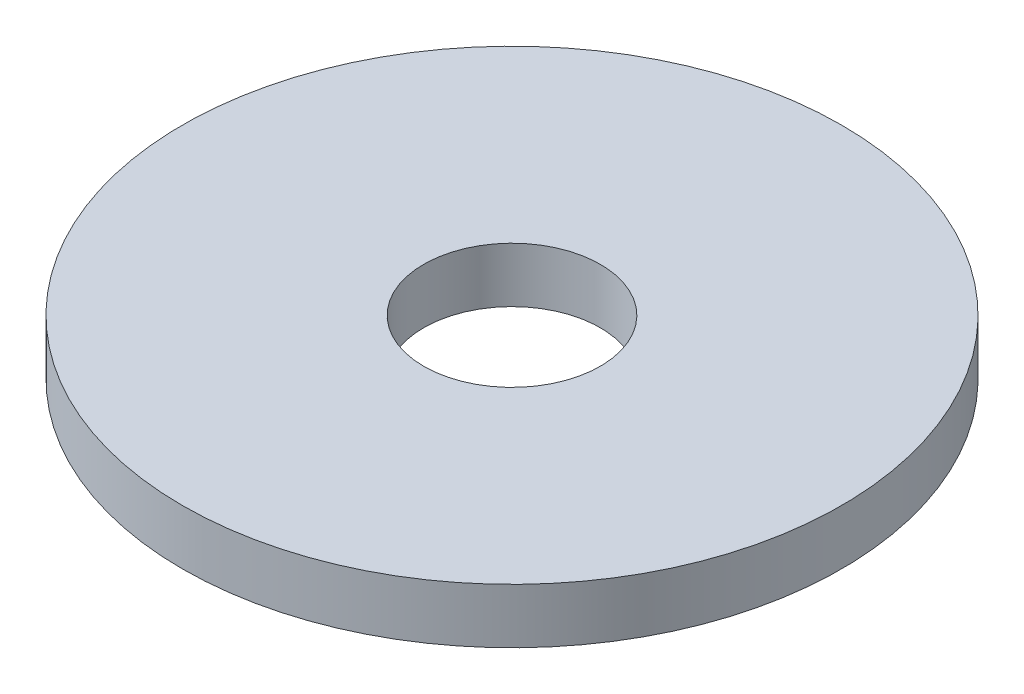
ISO-10303-21;
HEADER;
FILE_DESCRIPTION(('STEP AP214'),'2;1');
FILE_NAME('part.step','',(''),(''),'','','');
FILE_SCHEMA(('AUTOMOTIVE_DESIGN { 1 0 10303 214 1 1 1 1 }'));
ENDSEC;
DATA;
#1=APPLICATION_CONTEXT('core data for automotive mechanical design processes');
#2=APPLICATION_PROTOCOL_DEFINITION('international standard','automotive_design',2000,#1);
#3=PRODUCT_CONTEXT('',#1,'mechanical');
#4=PRODUCT('Part','Part','',(#3));
#5=PRODUCT_RELATED_PRODUCT_CATEGORY('part','',(#4));
#6=PRODUCT_DEFINITION_FORMATION('','',#4);
#7=PRODUCT_DEFINITION_CONTEXT('part definition',#1,'design');
#8=PRODUCT_DEFINITION('design','',#6,#7);
#9=PRODUCT_DEFINITION_SHAPE('','',#8);
#10=(LENGTH_UNIT() NAMED_UNIT(*) SI_UNIT(.MILLI.,.METRE.));
#11=(NAMED_UNIT(*) PLANE_ANGLE_UNIT() SI_UNIT($,.RADIAN.));
#12=(NAMED_UNIT(*) SI_UNIT($,.STERADIAN.) SOLID_ANGLE_UNIT());
#13=UNCERTAINTY_MEASURE_WITH_UNIT(LENGTH_MEASURE(1.E-05),#10,'distance_accuracy_value','');
#14=(GEOMETRIC_REPRESENTATION_CONTEXT(3) GLOBAL_UNCERTAINTY_ASSIGNED_CONTEXT((#13)) GLOBAL_UNIT_ASSIGNED_CONTEXT((#10,
#11,#12)) REPRESENTATION_CONTEXT('',''));
#15=CARTESIAN_POINT('',(0.,0.,0.));
#16=DIRECTION('',(0.,0.,1.));
#17=DIRECTION('',(1.,0.,0.));
#18=AXIS2_PLACEMENT_3D('',#15,#16,#17);
#19=CARTESIAN_POINT('',(0.,1.5875,0.));
#20=DIRECTION('',(0.,1.,0.));
#21=DIRECTION('',(0.,0.,1.));
#22=AXIS2_PLACEMENT_3D('',#19,#20,#21);
#23=PLANE('',#22);
#24=CARTESIAN_POINT('',(0.,1.5875,0.));
#25=DIRECTION('',(0.,1.,0.));
#26=DIRECTION('',(0.,0.,1.));
#27=AXIS2_PLACEMENT_3D('',#24,#25,#26);
#28=CIRCLE('',#27,9.525);
#29=CARTESIAN_POINT('',(0.,1.5875,9.525));
#30=VERTEX_POINT('',#29);
#31=EDGE_CURVE('E10',#30,#30,#28,.T.);
#32=ORIENTED_EDGE('',*,*,#31,.T.);
#33=EDGE_LOOP('',(#32));
#34=FACE_BOUND('',#33,.T.);
#35=CARTESIAN_POINT('',(0.,1.5875,0.));
#36=DIRECTION('',(0.,1.,0.));
#37=DIRECTION('',(0.,0.,1.));
#38=AXIS2_PLACEMENT_3D('',#35,#36,#37);
#39=CIRCLE('',#38,2.5527);
#40=CARTESIAN_POINT('',(0.,1.5875,2.5527));
#41=VERTEX_POINT('',#40);
#42=EDGE_CURVE('E48',#41,#41,#39,.T.);
#43=ORIENTED_EDGE('',*,*,#42,.F.);
#44=EDGE_LOOP('',(#43));
#45=FACE_BOUND('',#44,.T.);
#46=ADVANCED_FACE('F37',(#34,#45),#23,.T.);
#47=CARTESIAN_POINT('',(0.,0.,0.));
#48=DIRECTION('',(0.,1.,0.));
#49=DIRECTION('',(0.,0.,1.));
#50=AXIS2_PLACEMENT_3D('',#47,#48,#49);
#51=PLANE('',#50);
#52=CARTESIAN_POINT('',(0.,0.,0.));
#53=DIRECTION('',(0.,1.,0.));
#54=DIRECTION('',(0.,0.,1.));
#55=AXIS2_PLACEMENT_3D('',#52,#53,#54);
#56=CIRCLE('',#55,9.525);
#57=CARTESIAN_POINT('',(0.,0.,9.525));
#58=VERTEX_POINT('',#57);
#59=EDGE_CURVE('E41',#58,#58,#56,.T.);
#60=ORIENTED_EDGE('',*,*,#59,.F.);
#61=EDGE_LOOP('',(#60));
#62=FACE_BOUND('',#61,.T.);
#63=CARTESIAN_POINT('',(0.,0.,0.));
#64=DIRECTION('',(0.,1.,0.));
#65=DIRECTION('',(0.,0.,1.));
#66=AXIS2_PLACEMENT_3D('',#63,#64,#65);
#67=CIRCLE('',#66,2.5527);
#68=CARTESIAN_POINT('',(0.,0.,2.5527));
#69=VERTEX_POINT('',#68);
#70=EDGE_CURVE('E50',#69,#69,#67,.T.);
#71=ORIENTED_EDGE('',*,*,#70,.T.);
#72=EDGE_LOOP('',(#71));
#73=FACE_BOUND('',#72,.T.);
#74=ADVANCED_FACE('F60',(#62,#73),#51,.F.);
#75=CARTESIAN_POINT('',(0.,1.5875,0.));
#76=DIRECTION('',(0.,-1.,0.));
#77=DIRECTION('',(0.,0.,-1.));
#78=AXIS2_PLACEMENT_3D('',#75,#76,#77);
#79=CYLINDRICAL_SURFACE('',#78,9.525);
#80=ORIENTED_EDGE('',*,*,#31,.F.);
#81=EDGE_LOOP('',(#80));
#82=FACE_BOUND('',#81,.T.);
#83=ORIENTED_EDGE('',*,*,#59,.T.);
#84=EDGE_LOOP('',(#83));
#85=FACE_BOUND('',#84,.T.);
#86=ADVANCED_FACE('F39',(#82,#85),#79,.T.);
#87=CARTESIAN_POINT('',(0.,1.5875,0.));
#88=DIRECTION('',(0.,-1.,0.));
#89=DIRECTION('',(0.,0.,-1.));
#90=AXIS2_PLACEMENT_3D('',#87,#88,#89);
#91=CYLINDRICAL_SURFACE('',#90,2.5527);
#92=ORIENTED_EDGE('',*,*,#42,.T.);
#93=EDGE_LOOP('',(#92));
#94=FACE_BOUND('',#93,.T.);
#95=ORIENTED_EDGE('',*,*,#70,.F.);
#96=EDGE_LOOP('',(#95));
#97=FACE_BOUND('',#96,.T.);
#98=ADVANCED_FACE('F56',(#94,#97),#91,.F.);
#99=CLOSED_SHELL('',(#46,#74,#86,#98));
#100=MANIFOLD_SOLID_BREP('B2',#99);
#101=ADVANCED_BREP_SHAPE_REPRESENTATION('',(#18,#100),#14);
#102=SHAPE_DEFINITION_REPRESENTATION(#9,#101);
ENDSEC;
END-ISO-10303-21;
